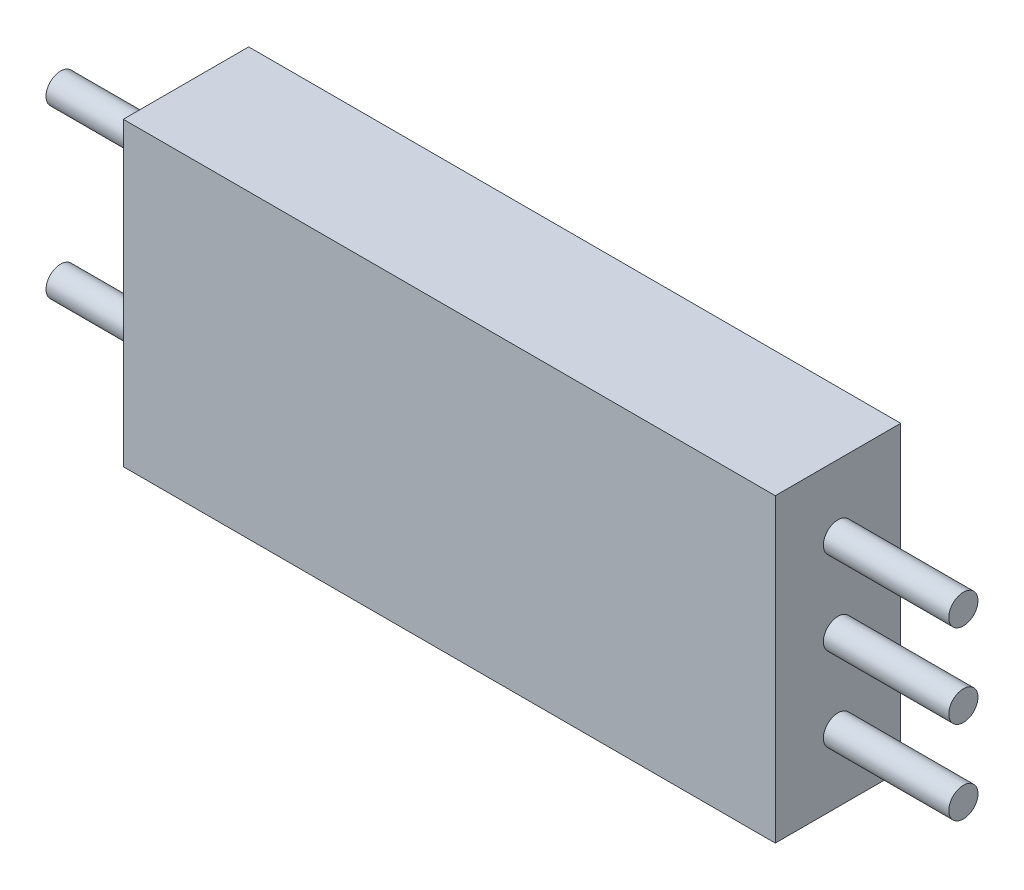
ISO-10303-21;
HEADER;
FILE_DESCRIPTION(('STEP AP214'),'2;1');
FILE_NAME('part.step','',(''),(''),'','','');
FILE_SCHEMA(('AUTOMOTIVE_DESIGN { 1 0 10303 214 1 1 1 1 }'));
ENDSEC;
DATA;
#1=APPLICATION_CONTEXT('core data for automotive mechanical design processes');
#2=APPLICATION_PROTOCOL_DEFINITION('international standard','automotive_design',2000,#1);
#3=PRODUCT_CONTEXT('',#1,'mechanical');
#4=PRODUCT('Part','Part','',(#3));
#5=PRODUCT_RELATED_PRODUCT_CATEGORY('part','',(#4));
#6=PRODUCT_DEFINITION_FORMATION('','',#4);
#7=PRODUCT_DEFINITION_CONTEXT('part definition',#1,'design');
#8=PRODUCT_DEFINITION('design','',#6,#7);
#9=PRODUCT_DEFINITION_SHAPE('','',#8);
#10=(LENGTH_UNIT() NAMED_UNIT(*) SI_UNIT(.MILLI.,.METRE.));
#11=(NAMED_UNIT(*) PLANE_ANGLE_UNIT() SI_UNIT($,.RADIAN.));
#12=(NAMED_UNIT(*) SI_UNIT($,.STERADIAN.) SOLID_ANGLE_UNIT());
#13=UNCERTAINTY_MEASURE_WITH_UNIT(LENGTH_MEASURE(1.E-05),#10,'distance_accuracy_value','');
#14=(GEOMETRIC_REPRESENTATION_CONTEXT(3) GLOBAL_UNCERTAINTY_ASSIGNED_CONTEXT((#13)) GLOBAL_UNIT_ASSIGNED_CONTEXT((#10,
#11,#12)) REPRESENTATION_CONTEXT('',''));
#15=CARTESIAN_POINT('',(0.,0.,0.));
#16=DIRECTION('',(0.,0.,1.));
#17=DIRECTION('',(1.,0.,0.));
#18=AXIS2_PLACEMENT_3D('',#15,#16,#17);
#19=CARTESIAN_POINT('',(39.,-18.,7.5));
#20=DIRECTION('',(-1.,0.,0.));
#21=DIRECTION('',(0.,0.,1.));
#22=AXIS2_PLACEMENT_3D('',#19,#20,#21);
#23=PLANE('',#22);
#24=CARTESIAN_POINT('',(39.,10.,0.));
#25=DIRECTION('',(-1.,0.,0.));
#26=DIRECTION('',(0.,0.,1.));
#27=AXIS2_PLACEMENT_3D('',#24,#25,#26);
#28=CIRCLE('',#27,1.75);
#29=CARTESIAN_POINT('',(39.,10.,1.75));
#30=VERTEX_POINT('',#29);
#31=EDGE_CURVE('E123',#30,#30,#28,.F.);
#32=ORIENTED_EDGE('',*,*,#31,.F.);
#33=EDGE_LOOP('',(#32));
#34=FACE_BOUND('',#33,.T.);
#35=CARTESIAN_POINT('',(39.,0.,0.));
#36=DIRECTION('',(-1.,0.,0.));
#37=DIRECTION('',(0.,0.,1.));
#38=AXIS2_PLACEMENT_3D('',#35,#36,#37);
#39=CIRCLE('',#38,1.75);
#40=CARTESIAN_POINT('',(39.,0.,1.75));
#41=VERTEX_POINT('',#40);
#42=EDGE_CURVE('E120',#41,#41,#39,.F.);
#43=ORIENTED_EDGE('',*,*,#42,.F.);
#44=EDGE_LOOP('',(#43));
#45=FACE_BOUND('',#44,.T.);
#46=CARTESIAN_POINT('',(39.,-9.99999999999999,0.));
#47=DIRECTION('',(-1.,0.,0.));
#48=DIRECTION('',(0.,0.,1.));
#49=AXIS2_PLACEMENT_3D('',#46,#47,#48);
#50=CIRCLE('',#49,1.75);
#51=CARTESIAN_POINT('',(39.,-9.99999999999999,1.75));
#52=VERTEX_POINT('',#51);
#53=EDGE_CURVE('E117',#52,#52,#50,.F.);
#54=ORIENTED_EDGE('',*,*,#53,.F.);
#55=EDGE_LOOP('',(#54));
#56=FACE_BOUND('',#55,.T.);
#57=DIRECTION('',(0.,1.,0.));
#58=VECTOR('',#57,1.);
#59=CARTESIAN_POINT('',(39.,-18.,-7.5));
#60=LINE('',#59,#58);
#61=CARTESIAN_POINT('',(39.,-18.,-7.5));
#62=VERTEX_POINT('',#61);
#63=CARTESIAN_POINT('',(39.,18.,-7.5));
#64=VERTEX_POINT('',#63);
#65=EDGE_CURVE('E107',#62,#64,#60,.T.);
#66=ORIENTED_EDGE('',*,*,#65,.T.);
#67=DIRECTION('',(0.,0.,-1.));
#68=VECTOR('',#67,1.);
#69=CARTESIAN_POINT('',(39.,18.,7.5));
#70=LINE('',#69,#68);
#71=CARTESIAN_POINT('',(39.,18.,7.5));
#72=VERTEX_POINT('',#71);
#73=EDGE_CURVE('E98',#72,#64,#70,.T.);
#74=ORIENTED_EDGE('',*,*,#73,.F.);
#75=DIRECTION('',(0.,1.,0.));
#76=VECTOR('',#75,1.);
#77=CARTESIAN_POINT('',(39.,-18.,7.5));
#78=LINE('',#77,#76);
#79=CARTESIAN_POINT('',(39.,-18.,7.5));
#80=VERTEX_POINT('',#79);
#81=EDGE_CURVE('E92',#80,#72,#78,.T.);
#82=ORIENTED_EDGE('',*,*,#81,.F.);
#83=DIRECTION('',(0.,0.,-1.));
#84=VECTOR('',#83,1.);
#85=CARTESIAN_POINT('',(39.,-18.,7.5));
#86=LINE('',#85,#84);
#87=EDGE_CURVE('E103',#80,#62,#86,.T.);
#88=ORIENTED_EDGE('',*,*,#87,.T.);
#89=EDGE_LOOP('',(#66,#74,#82,#88));
#90=FACE_BOUND('',#89,.T.);
#91=ADVANCED_FACE('F40',(#34,#45,#56,#90),#23,.F.);
#92=CARTESIAN_POINT('',(-39.,18.,7.5));
#93=DIRECTION('',(0.,-1.,0.));
#94=DIRECTION('',(0.,0.,-1.));
#95=AXIS2_PLACEMENT_3D('',#92,#93,#94);
#96=PLANE('',#95);
#97=DIRECTION('',(-1.,0.,0.));
#98=VECTOR('',#97,1.);
#99=CARTESIAN_POINT('',(-39.,18.,-7.5));
#100=LINE('',#99,#98);
#101=CARTESIAN_POINT('',(-39.,18.,-7.5));
#102=VERTEX_POINT('',#101);
#103=EDGE_CURVE('E97',#64,#102,#100,.T.);
#104=ORIENTED_EDGE('',*,*,#103,.T.);
#105=DIRECTION('',(0.,0.,-1.));
#106=VECTOR('',#105,1.);
#107=CARTESIAN_POINT('',(-39.,18.,7.5));
#108=LINE('',#107,#106);
#109=CARTESIAN_POINT('',(-39.,18.,7.5));
#110=VERTEX_POINT('',#109);
#111=EDGE_CURVE('E95',#110,#102,#108,.T.);
#112=ORIENTED_EDGE('',*,*,#111,.F.);
#113=DIRECTION('',(-1.,0.,0.));
#114=VECTOR('',#113,1.);
#115=CARTESIAN_POINT('',(-39.,18.,7.5));
#116=LINE('',#115,#114);
#117=EDGE_CURVE('E87',#72,#110,#116,.T.);
#118=ORIENTED_EDGE('',*,*,#117,.F.);
#119=ORIENTED_EDGE('',*,*,#73,.T.);
#120=EDGE_LOOP('',(#104,#112,#118,#119));
#121=FACE_BOUND('',#120,.T.);
#122=ADVANCED_FACE('F96',(#121),#96,.F.);
#123=CARTESIAN_POINT('',(-39.,-18.,7.5));
#124=DIRECTION('',(1.,0.,0.));
#125=DIRECTION('',(0.,0.,-1.));
#126=AXIS2_PLACEMENT_3D('',#123,#124,#125);
#127=PLANE('',#126);
#128=CARTESIAN_POINT('',(-39.,-10.,0.));
#129=DIRECTION('',(1.,0.,0.));
#130=DIRECTION('',(0.,0.,-1.));
#131=AXIS2_PLACEMENT_3D('',#128,#129,#130);
#132=CIRCLE('',#131,1.75);
#133=CARTESIAN_POINT('',(-39.,-10.,-1.75));
#134=VERTEX_POINT('',#133);
#135=EDGE_CURVE('E11',#134,#134,#132,.F.);
#136=ORIENTED_EDGE('',*,*,#135,.F.);
#137=EDGE_LOOP('',(#136));
#138=FACE_BOUND('',#137,.T.);
#139=CARTESIAN_POINT('',(-39.,10.,0.));
#140=DIRECTION('',(1.,0.,0.));
#141=DIRECTION('',(0.,0.,-1.));
#142=AXIS2_PLACEMENT_3D('',#139,#140,#141);
#143=CIRCLE('',#142,1.75);
#144=CARTESIAN_POINT('',(-39.,10.,-1.75));
#145=VERTEX_POINT('',#144);
#146=EDGE_CURVE('E48',#145,#145,#143,.F.);
#147=ORIENTED_EDGE('',*,*,#146,.F.);
#148=EDGE_LOOP('',(#147));
#149=FACE_BOUND('',#148,.T.);
#150=DIRECTION('',(0.,-1.,0.));
#151=VECTOR('',#150,1.);
#152=CARTESIAN_POINT('',(-39.,-18.,-7.5));
#153=LINE('',#152,#151);
#154=CARTESIAN_POINT('',(-39.,-18.,-7.5));
#155=VERTEX_POINT('',#154);
#156=EDGE_CURVE('E73',#102,#155,#153,.T.);
#157=ORIENTED_EDGE('',*,*,#156,.T.);
#158=DIRECTION('',(0.,0.,-1.));
#159=VECTOR('',#158,1.);
#160=CARTESIAN_POINT('',(-39.,-18.,7.5));
#161=LINE('',#160,#159);
#162=CARTESIAN_POINT('',(-39.,-18.,7.5));
#163=VERTEX_POINT('',#162);
#164=EDGE_CURVE('E99',#163,#155,#161,.T.);
#165=ORIENTED_EDGE('',*,*,#164,.F.);
#166=DIRECTION('',(0.,-1.,0.));
#167=VECTOR('',#166,1.);
#168=CARTESIAN_POINT('',(-39.,-18.,7.5));
#169=LINE('',#168,#167);
#170=EDGE_CURVE('E90',#110,#163,#169,.T.);
#171=ORIENTED_EDGE('',*,*,#170,.F.);
#172=ORIENTED_EDGE('',*,*,#111,.T.);
#173=EDGE_LOOP('',(#157,#165,#171,#172));
#174=FACE_BOUND('',#173,.T.);
#175=ADVANCED_FACE('F101',(#138,#149,#174),#127,.F.);
#176=CARTESIAN_POINT('',(-39.,-18.,7.5));
#177=DIRECTION('',(0.,1.,0.));
#178=DIRECTION('',(0.,0.,1.));
#179=AXIS2_PLACEMENT_3D('',#176,#177,#178);
#180=PLANE('',#179);
#181=DIRECTION('',(1.,0.,0.));
#182=VECTOR('',#181,1.);
#183=CARTESIAN_POINT('',(-39.,-18.,-7.5));
#184=LINE('',#183,#182);
#185=EDGE_CURVE('E79',#155,#62,#184,.T.);
#186=ORIENTED_EDGE('',*,*,#185,.T.);
#187=ORIENTED_EDGE('',*,*,#87,.F.);
#188=DIRECTION('',(1.,0.,0.));
#189=VECTOR('',#188,1.);
#190=CARTESIAN_POINT('',(-39.,-18.,7.5));
#191=LINE('',#190,#189);
#192=EDGE_CURVE('E56',#163,#80,#191,.T.);
#193=ORIENTED_EDGE('',*,*,#192,.F.);
#194=ORIENTED_EDGE('',*,*,#164,.T.);
#195=EDGE_LOOP('',(#186,#187,#193,#194));
#196=FACE_BOUND('',#195,.T.);
#197=ADVANCED_FACE('F131',(#196),#180,.F.);
#198=CARTESIAN_POINT('',(0.,0.,7.5));
#199=DIRECTION('',(0.,0.,-1.));
#200=DIRECTION('',(-1.,0.,0.));
#201=AXIS2_PLACEMENT_3D('',#198,#199,#200);
#202=PLANE('',#201);
#203=ORIENTED_EDGE('',*,*,#81,.T.);
#204=ORIENTED_EDGE('',*,*,#117,.T.);
#205=ORIENTED_EDGE('',*,*,#170,.T.);
#206=ORIENTED_EDGE('',*,*,#192,.T.);
#207=EDGE_LOOP('',(#203,#204,#205,#206));
#208=FACE_BOUND('',#207,.T.);
#209=ADVANCED_FACE('F88',(#208),#202,.F.);
#210=CARTESIAN_POINT('',(0.,0.,-7.5));
#211=DIRECTION('',(0.,0.,-1.));
#212=DIRECTION('',(-1.,0.,0.));
#213=AXIS2_PLACEMENT_3D('',#210,#211,#212);
#214=PLANE('',#213);
#215=ORIENTED_EDGE('',*,*,#65,.F.);
#216=ORIENTED_EDGE('',*,*,#185,.F.);
#217=ORIENTED_EDGE('',*,*,#156,.F.);
#218=ORIENTED_EDGE('',*,*,#103,.F.);
#219=EDGE_LOOP('',(#215,#216,#217,#218));
#220=FACE_BOUND('',#219,.T.);
#221=ADVANCED_FACE('F152',(#220),#214,.T.);
#222=CARTESIAN_POINT('',(54.,-9.99999999999999,0.));
#223=DIRECTION('',(-1.,0.,0.));
#224=DIRECTION('',(0.,0.,1.));
#225=AXIS2_PLACEMENT_3D('',#222,#223,#224);
#226=CYLINDRICAL_SURFACE('',#225,1.75);
#227=CARTESIAN_POINT('',(54.,-9.99999999999999,0.));
#228=DIRECTION('',(1.,0.,0.));
#229=DIRECTION('',(0.,0.,-1.));
#230=AXIS2_PLACEMENT_3D('',#227,#228,#229);
#231=CIRCLE('',#230,1.75);
#232=CARTESIAN_POINT('',(54.,-9.99999999999999,-1.75));
#233=VERTEX_POINT('',#232);
#234=EDGE_CURVE('E110',#233,#233,#231,.T.);
#235=ORIENTED_EDGE('',*,*,#234,.F.);
#236=EDGE_LOOP('',(#235));
#237=FACE_BOUND('',#236,.T.);
#238=ORIENTED_EDGE('',*,*,#53,.T.);
#239=EDGE_LOOP('',(#238));
#240=FACE_BOUND('',#239,.T.);
#241=ADVANCED_FACE('F154',(#237,#240),#226,.T.);
#242=CARTESIAN_POINT('',(54.,-9.99999999999999,0.));
#243=DIRECTION('',(1.,0.,0.));
#244=DIRECTION('',(0.,0.,-1.));
#245=AXIS2_PLACEMENT_3D('',#242,#243,#244);
#246=PLANE('',#245);
#247=ORIENTED_EDGE('',*,*,#234,.T.);
#248=EDGE_LOOP('',(#247));
#249=FACE_BOUND('',#248,.T.);
#250=ADVANCED_FACE('F160',(#249),#246,.T.);
#251=CARTESIAN_POINT('',(54.,0.,0.));
#252=DIRECTION('',(-1.,0.,0.));
#253=DIRECTION('',(0.,0.,1.));
#254=AXIS2_PLACEMENT_3D('',#251,#252,#253);
#255=CYLINDRICAL_SURFACE('',#254,1.75);
#256=CARTESIAN_POINT('',(54.,0.,0.));
#257=DIRECTION('',(1.,0.,0.));
#258=DIRECTION('',(0.,0.,-1.));
#259=AXIS2_PLACEMENT_3D('',#256,#257,#258);
#260=CIRCLE('',#259,1.75);
#261=CARTESIAN_POINT('',(54.,0.,-1.75));
#262=VERTEX_POINT('',#261);
#263=EDGE_CURVE('E211',#262,#262,#260,.T.);
#264=ORIENTED_EDGE('',*,*,#263,.F.);
#265=EDGE_LOOP('',(#264));
#266=FACE_BOUND('',#265,.T.);
#267=ORIENTED_EDGE('',*,*,#42,.T.);
#268=EDGE_LOOP('',(#267));
#269=FACE_BOUND('',#268,.T.);
#270=ADVANCED_FACE('F167',(#266,#269),#255,.T.);
#271=CARTESIAN_POINT('',(54.,0.,0.));
#272=DIRECTION('',(1.,0.,0.));
#273=DIRECTION('',(0.,0.,-1.));
#274=AXIS2_PLACEMENT_3D('',#271,#272,#273);
#275=PLANE('',#274);
#276=ORIENTED_EDGE('',*,*,#263,.T.);
#277=EDGE_LOOP('',(#276));
#278=FACE_BOUND('',#277,.T.);
#279=ADVANCED_FACE('F171',(#278),#275,.T.);
#280=CARTESIAN_POINT('',(54.,10.,0.));
#281=DIRECTION('',(-1.,0.,0.));
#282=DIRECTION('',(0.,0.,1.));
#283=AXIS2_PLACEMENT_3D('',#280,#281,#282);
#284=CYLINDRICAL_SURFACE('',#283,1.75);
#285=CARTESIAN_POINT('',(54.,10.,0.));
#286=DIRECTION('',(1.,0.,0.));
#287=DIRECTION('',(0.,0.,-1.));
#288=AXIS2_PLACEMENT_3D('',#285,#286,#287);
#289=CIRCLE('',#288,1.75);
#290=CARTESIAN_POINT('',(54.,10.,-1.75));
#291=VERTEX_POINT('',#290);
#292=EDGE_CURVE('E206',#291,#291,#289,.T.);
#293=ORIENTED_EDGE('',*,*,#292,.F.);
#294=EDGE_LOOP('',(#293));
#295=FACE_BOUND('',#294,.T.);
#296=ORIENTED_EDGE('',*,*,#31,.T.);
#297=EDGE_LOOP('',(#296));
#298=FACE_BOUND('',#297,.T.);
#299=ADVANCED_FACE('F175',(#295,#298),#284,.T.);
#300=CARTESIAN_POINT('',(54.,10.,0.));
#301=DIRECTION('',(1.,0.,0.));
#302=DIRECTION('',(0.,0.,-1.));
#303=AXIS2_PLACEMENT_3D('',#300,#301,#302);
#304=PLANE('',#303);
#305=ORIENTED_EDGE('',*,*,#292,.T.);
#306=EDGE_LOOP('',(#305));
#307=FACE_BOUND('',#306,.T.);
#308=ADVANCED_FACE('F179',(#307),#304,.T.);
#309=CARTESIAN_POINT('',(-54.,10.,0.));
#310=DIRECTION('',(1.,0.,0.));
#311=DIRECTION('',(0.,0.,-1.));
#312=AXIS2_PLACEMENT_3D('',#309,#310,#311);
#313=CYLINDRICAL_SURFACE('',#312,1.75);
#314=CARTESIAN_POINT('',(-54.,10.,0.));
#315=DIRECTION('',(-1.,0.,0.));
#316=DIRECTION('',(0.,0.,1.));
#317=AXIS2_PLACEMENT_3D('',#314,#315,#316);
#318=CIRCLE('',#317,1.75);
#319=CARTESIAN_POINT('',(-54.,10.,1.75));
#320=VERTEX_POINT('',#319);
#321=EDGE_CURVE('E203',#320,#320,#318,.T.);
#322=ORIENTED_EDGE('',*,*,#321,.F.);
#323=EDGE_LOOP('',(#322));
#324=FACE_BOUND('',#323,.T.);
#325=ORIENTED_EDGE('',*,*,#146,.T.);
#326=EDGE_LOOP('',(#325));
#327=FACE_BOUND('',#326,.T.);
#328=ADVANCED_FACE('F128',(#324,#327),#313,.T.);
#329=CARTESIAN_POINT('',(-54.,10.,0.));
#330=DIRECTION('',(-1.,0.,0.));
#331=DIRECTION('',(0.,0.,1.));
#332=AXIS2_PLACEMENT_3D('',#329,#330,#331);
#333=PLANE('',#332);
#334=ORIENTED_EDGE('',*,*,#321,.T.);
#335=EDGE_LOOP('',(#334));
#336=FACE_BOUND('',#335,.T.);
#337=ADVANCED_FACE('F186',(#336),#333,.T.);
#338=CARTESIAN_POINT('',(-54.,-10.,0.));
#339=DIRECTION('',(1.,0.,0.));
#340=DIRECTION('',(0.,0.,-1.));
#341=AXIS2_PLACEMENT_3D('',#338,#339,#340);
#342=CYLINDRICAL_SURFACE('',#341,1.75);
#343=CARTESIAN_POINT('',(-54.,-10.,0.));
#344=DIRECTION('',(-1.,0.,0.));
#345=DIRECTION('',(0.,0.,1.));
#346=AXIS2_PLACEMENT_3D('',#343,#344,#345);
#347=CIRCLE('',#346,1.75);
#348=CARTESIAN_POINT('',(-54.,-10.,1.75));
#349=VERTEX_POINT('',#348);
#350=EDGE_CURVE('E202',#349,#349,#347,.T.);
#351=ORIENTED_EDGE('',*,*,#350,.F.);
#352=EDGE_LOOP('',(#351));
#353=FACE_BOUND('',#352,.T.);
#354=ORIENTED_EDGE('',*,*,#135,.T.);
#355=EDGE_LOOP('',(#354));
#356=FACE_BOUND('',#355,.T.);
#357=ADVANCED_FACE('F190',(#353,#356),#342,.T.);
#358=CARTESIAN_POINT('',(-54.,-10.,0.));
#359=DIRECTION('',(-1.,0.,0.));
#360=DIRECTION('',(0.,0.,1.));
#361=AXIS2_PLACEMENT_3D('',#358,#359,#360);
#362=PLANE('',#361);
#363=ORIENTED_EDGE('',*,*,#350,.T.);
#364=EDGE_LOOP('',(#363));
#365=FACE_BOUND('',#364,.T.);
#366=ADVANCED_FACE('F194',(#365),#362,.T.);
#367=CLOSED_SHELL('',(#91,#122,#175,#197,#209,#221,#241,#250,#270,#279,#299,#308,#328,#337,#357,#366));
#368=MANIFOLD_SOLID_BREP('B2',#367);
#369=ADVANCED_BREP_SHAPE_REPRESENTATION('',(#18,#368),#14);
#370=SHAPE_DEFINITION_REPRESENTATION(#9,#369);
ENDSEC;
END-ISO-10303-21;
